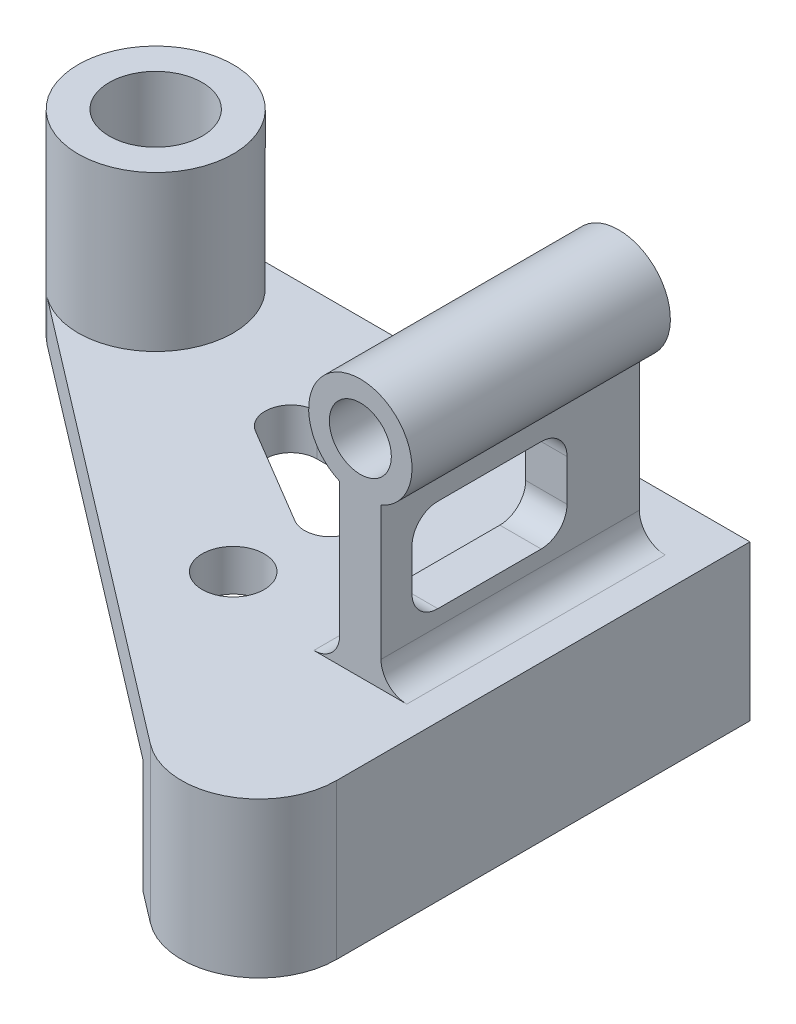
ISO-10303-21;
HEADER;
FILE_DESCRIPTION(('STEP AP214'),'2;1');
FILE_NAME('part.step','',(''),(''),'','','');
FILE_SCHEMA(('AUTOMOTIVE_DESIGN { 1 0 10303 214 1 1 1 1 }'));
ENDSEC;
DATA;
#1=APPLICATION_CONTEXT('core data for automotive mechanical design processes');
#2=APPLICATION_PROTOCOL_DEFINITION('international standard','automotive_design',2000,#1);
#3=PRODUCT_CONTEXT('',#1,'mechanical');
#4=PRODUCT('Part','Part','',(#3));
#5=PRODUCT_RELATED_PRODUCT_CATEGORY('part','',(#4));
#6=PRODUCT_DEFINITION_FORMATION('','',#4);
#7=PRODUCT_DEFINITION_CONTEXT('part definition',#1,'design');
#8=PRODUCT_DEFINITION('design','',#6,#7);
#9=PRODUCT_DEFINITION_SHAPE('','',#8);
#10=(LENGTH_UNIT() NAMED_UNIT(*) SI_UNIT(.MILLI.,.METRE.));
#11=(NAMED_UNIT(*) PLANE_ANGLE_UNIT() SI_UNIT($,.RADIAN.));
#12=(NAMED_UNIT(*) SI_UNIT($,.STERADIAN.) SOLID_ANGLE_UNIT());
#13=UNCERTAINTY_MEASURE_WITH_UNIT(LENGTH_MEASURE(1.E-05),#10,'distance_accuracy_value','');
#14=(GEOMETRIC_REPRESENTATION_CONTEXT(3) GLOBAL_UNCERTAINTY_ASSIGNED_CONTEXT((#13)) GLOBAL_UNIT_ASSIGNED_CONTEXT((#10,
#11,#12)) REPRESENTATION_CONTEXT('',''));
#15=CARTESIAN_POINT('',(0.,0.,0.));
#16=DIRECTION('',(0.,0.,1.));
#17=DIRECTION('',(1.,0.,0.));
#18=AXIS2_PLACEMENT_3D('',#15,#16,#17);
#19=CARTESIAN_POINT('',(0.,50.,10.3951988733973));
#20=DIRECTION('',(0.,0.,-1.));
#21=DIRECTION('',(-1.,0.,0.));
#22=AXIS2_PLACEMENT_3D('',#19,#20,#21);
#23=PLANE('',#22);
#24=CARTESIAN_POINT('',(-15.,40.,10.3951988733973));
#25=DIRECTION('',(0.,0.,-1.));
#26=DIRECTION('',(-1.,0.,0.));
#27=AXIS2_PLACEMENT_3D('',#24,#25,#26);
#28=CIRCLE('',#27,6.);
#29=CARTESIAN_POINT('',(-21.,40.,10.3951988733973));
#30=VERTEX_POINT('',#29);
#31=EDGE_CURVE('E394',#30,#30,#28,.T.);
#32=ORIENTED_EDGE('',*,*,#31,.F.);
#33=EDGE_LOOP('',(#32));
#34=FACE_BOUND('',#33,.T.);
#35=CARTESIAN_POINT('',(-15.,40.,10.3951988733973));
#36=DIRECTION('',(0.,0.,-1.));
#37=DIRECTION('',(-1.,0.,0.));
#38=AXIS2_PLACEMENT_3D('',#35,#36,#37);
#39=CIRCLE('',#38,10.);
#40=CARTESIAN_POINT('',(-19.,30.8348486100883,10.3951988733973));
#41=VERTEX_POINT('',#40);
#42=CARTESIAN_POINT('',(-11.,30.8348486100883,10.3951988733973));
#43=VERTEX_POINT('',#42);
#44=EDGE_CURVE('E415',#41,#43,#39,.T.);
#45=ORIENTED_EDGE('',*,*,#44,.T.);
#46=DIRECTION('',(0.,-1.,0.));
#47=VECTOR('',#46,1.);
#48=CARTESIAN_POINT('',(-11.,50.,10.3951988733973));
#49=LINE('',#48,#47);
#50=CARTESIAN_POINT('',(-11.,5.,10.3951988733973));
#51=VERTEX_POINT('',#50);
#52=EDGE_CURVE('E407',#43,#51,#49,.T.);
#53=ORIENTED_EDGE('',*,*,#52,.T.);
#54=CARTESIAN_POINT('',(-5.99999999999999,5.,10.3951988733973));
#55=DIRECTION('',(0.,0.,-1.));
#56=DIRECTION('',(-1.,0.,0.));
#57=AXIS2_PLACEMENT_3D('',#54,#55,#56);
#58=CIRCLE('',#57,5.);
#59=CARTESIAN_POINT('',(-5.99999999999999,0.,10.3951988733973));
#60=VERTEX_POINT('',#59);
#61=EDGE_CURVE('E554',#51,#60,#58,.F.);
#62=ORIENTED_EDGE('',*,*,#61,.T.);
#63=DIRECTION('',(1.,0.,0.));
#64=VECTOR('',#63,1.);
#65=CARTESIAN_POINT('',(0.,0.,10.3951988733973));
#66=LINE('',#65,#64);
#67=CARTESIAN_POINT('',(-24.,0.,10.3951988733973));
#68=VERTEX_POINT('',#67);
#69=EDGE_CURVE('E417',#68,#60,#66,.T.);
#70=ORIENTED_EDGE('',*,*,#69,.F.);
#71=CARTESIAN_POINT('',(-24.,5.,10.3951988733973));
#72=DIRECTION('',(0.,0.,-1.));
#73=DIRECTION('',(-1.,0.,0.));
#74=AXIS2_PLACEMENT_3D('',#71,#72,#73);
#75=CIRCLE('',#74,5.);
#76=CARTESIAN_POINT('',(-19.,5.,10.3951988733973));
#77=VERTEX_POINT('',#76);
#78=EDGE_CURVE('E12',#68,#77,#75,.F.);
#79=ORIENTED_EDGE('',*,*,#78,.T.);
#80=DIRECTION('',(0.,1.,0.));
#81=VECTOR('',#80,1.);
#82=CARTESIAN_POINT('',(-19.,50.,10.3951988733973));
#83=LINE('',#82,#81);
#84=EDGE_CURVE('E413',#77,#41,#83,.T.);
#85=ORIENTED_EDGE('',*,*,#84,.T.);
#86=EDGE_LOOP('',(#45,#53,#62,#70,#79,#85));
#87=FACE_BOUND('',#86,.T.);
#88=ADVANCED_FACE('F156',(#34,#87),#23,.T.);
#89=CARTESIAN_POINT('',(0.,50.,60.3951988733973));
#90=DIRECTION('',(0.,0.,-1.));
#91=DIRECTION('',(-1.,0.,0.));
#92=AXIS2_PLACEMENT_3D('',#89,#90,#91);
#93=PLANE('',#92);
#94=CARTESIAN_POINT('',(-15.,40.,60.3951988733973));
#95=DIRECTION('',(0.,0.,1.));
#96=DIRECTION('',(1.,0.,0.));
#97=AXIS2_PLACEMENT_3D('',#94,#95,#96);
#98=CIRCLE('',#97,6.);
#99=CARTESIAN_POINT('',(-8.99999999999999,40.,60.3951988733973));
#100=VERTEX_POINT('',#99);
#101=EDGE_CURVE('E391',#100,#100,#98,.T.);
#102=ORIENTED_EDGE('',*,*,#101,.F.);
#103=EDGE_LOOP('',(#102));
#104=FACE_BOUND('',#103,.T.);
#105=DIRECTION('',(1.,0.,0.));
#106=VECTOR('',#105,1.);
#107=CARTESIAN_POINT('',(0.,0.,60.3951988733973));
#108=LINE('',#107,#106);
#109=CARTESIAN_POINT('',(-24.,0.,60.3951988733973));
#110=VERTEX_POINT('',#109);
#111=CARTESIAN_POINT('',(-5.99999999999999,0.,60.3951988733973));
#112=VERTEX_POINT('',#111);
#113=EDGE_CURVE('E419',#110,#112,#108,.T.);
#114=ORIENTED_EDGE('',*,*,#113,.T.);
#115=CARTESIAN_POINT('',(-5.99999999999999,5.,60.3951988733973));
#116=DIRECTION('',(0.,0.,-1.));
#117=DIRECTION('',(-1.,0.,0.));
#118=AXIS2_PLACEMENT_3D('',#115,#116,#117);
#119=CIRCLE('',#118,5.);
#120=CARTESIAN_POINT('',(-11.,5.,60.3951988733973));
#121=VERTEX_POINT('',#120);
#122=EDGE_CURVE('E552',#112,#121,#119,.T.);
#123=ORIENTED_EDGE('',*,*,#122,.T.);
#124=DIRECTION('',(0.,1.,0.));
#125=VECTOR('',#124,1.);
#126=CARTESIAN_POINT('',(-11.,0.,60.3951988733973));
#127=LINE('',#126,#125);
#128=CARTESIAN_POINT('',(-11.,30.8348486100883,60.3951988733973));
#129=VERTEX_POINT('',#128);
#130=EDGE_CURVE('E397',#121,#129,#127,.T.);
#131=ORIENTED_EDGE('',*,*,#130,.T.);
#132=CARTESIAN_POINT('',(-15.,40.,60.3951988733973));
#133=DIRECTION('',(0.,0.,1.));
#134=DIRECTION('',(1.,0.,0.));
#135=AXIS2_PLACEMENT_3D('',#132,#133,#134);
#136=CIRCLE('',#135,10.);
#137=CARTESIAN_POINT('',(-19.,30.8348486100883,60.3951988733973));
#138=VERTEX_POINT('',#137);
#139=EDGE_CURVE('E398',#129,#138,#136,.T.);
#140=ORIENTED_EDGE('',*,*,#139,.T.);
#141=DIRECTION('',(0.,-1.,0.));
#142=VECTOR('',#141,1.);
#143=CARTESIAN_POINT('',(-19.,0.,60.3951988733973));
#144=LINE('',#143,#142);
#145=CARTESIAN_POINT('',(-19.,5.,60.3951988733973));
#146=VERTEX_POINT('',#145);
#147=EDGE_CURVE('E401',#138,#146,#144,.T.);
#148=ORIENTED_EDGE('',*,*,#147,.T.);
#149=CARTESIAN_POINT('',(-24.,5.,60.3951988733973));
#150=DIRECTION('',(0.,0.,-1.));
#151=DIRECTION('',(-1.,0.,0.));
#152=AXIS2_PLACEMENT_3D('',#149,#150,#151);
#153=CIRCLE('',#152,5.);
#154=EDGE_CURVE('E164',#146,#110,#153,.T.);
#155=ORIENTED_EDGE('',*,*,#154,.T.);
#156=EDGE_LOOP('',(#114,#123,#131,#140,#148,#155));
#157=FACE_BOUND('',#156,.T.);
#158=ADVANCED_FACE('F559',(#104,#157),#93,.F.);
#159=CARTESIAN_POINT('',(0.,0.,0.));
#160=DIRECTION('',(0.,1.,0.));
#161=DIRECTION('',(0.,0.,1.));
#162=AXIS2_PLACEMENT_3D('',#159,#160,#161);
#163=PLANE('',#162);
#164=DIRECTION('',(0.,0.,1.));
#165=VECTOR('',#164,1.);
#166=CARTESIAN_POINT('',(-5.99999999999999,0.,60.3951988733973));
#167=LINE('',#166,#165);
#168=EDGE_CURVE('E544',#60,#112,#167,.T.);
#169=ORIENTED_EDGE('',*,*,#168,.T.);
#170=ORIENTED_EDGE('',*,*,#113,.F.);
#171=DIRECTION('',(0.,0.,1.));
#172=VECTOR('',#171,1.);
#173=CARTESIAN_POINT('',(-24.,0.,10.3951988733973));
#174=LINE('',#173,#172);
#175=EDGE_CURVE('E431',#110,#68,#174,.F.);
#176=ORIENTED_EDGE('',*,*,#175,.T.);
#177=ORIENTED_EDGE('',*,*,#69,.T.);
#178=EDGE_LOOP('',(#169,#170,#176,#177));
#179=FACE_BOUND('',#178,.T.);
#180=DIRECTION('',(-1.,0.,0.));
#181=VECTOR('',#180,1.);
#182=CARTESIAN_POINT('',(0.,0.,0.));
#183=LINE('',#182,#181);
#184=CARTESIAN_POINT('',(0.,0.,0.));
#185=VERTEX_POINT('',#184);
#186=CARTESIAN_POINT('',(-100.,0.,0.));
#187=VERTEX_POINT('',#186);
#188=EDGE_CURVE('E496',#185,#187,#183,.T.);
#189=ORIENTED_EDGE('',*,*,#188,.T.);
#190=CARTESIAN_POINT('',(-100.,0.,15.));
#191=DIRECTION('',(0.,1.,0.));
#192=DIRECTION('',(0.,0.,1.));
#193=AXIS2_PLACEMENT_3D('',#190,#191,#192);
#194=CIRCLE('',#193,15.);
#195=CARTESIAN_POINT('',(-109.111751613562,0.,26.9153674946579));
#196=VERTEX_POINT('',#195);
#197=EDGE_CURVE('E428',#196,#187,#194,.T.);
#198=ORIENTED_EDGE('',*,*,#197,.F.);
#199=DIRECTION('',(-0.794357832977196,0.,-0.607450107570797));
#200=VECTOR('',#199,1.);
#201=CARTESIAN_POINT('',(-53.2493061987148,0.,69.6337081060117));
#202=LINE('',#201,#200);
#203=CARTESIAN_POINT('',(-24.1117516135619,0.,91.9153674946579));
#204=VERTEX_POINT('',#203);
#205=EDGE_CURVE('E487',#204,#196,#202,.T.);
#206=ORIENTED_EDGE('',*,*,#205,.F.);
#207=CARTESIAN_POINT('',(-15.,0.,80.));
#208=DIRECTION('',(0.,1.,0.));
#209=DIRECTION('',(0.,0.,1.));
#210=AXIS2_PLACEMENT_3D('',#207,#208,#209);
#211=CIRCLE('',#210,15.);
#212=CARTESIAN_POINT('',(0.,0.,80.));
#213=VERTEX_POINT('',#212);
#214=EDGE_CURVE('E490',#204,#213,#211,.T.);
#215=ORIENTED_EDGE('',*,*,#214,.T.);
#216=DIRECTION('',(0.,0.,1.));
#217=VECTOR('',#216,1.);
#218=CARTESIAN_POINT('',(0.,0.,0.));
#219=LINE('',#218,#217);
#220=EDGE_CURVE('E493',#185,#213,#219,.T.);
#221=ORIENTED_EDGE('',*,*,#220,.F.);
#222=EDGE_LOOP('',(#189,#198,#206,#215,#221));
#223=FACE_BOUND('',#222,.T.);
#224=CARTESIAN_POINT('',(-45.,0.,55.));
#225=DIRECTION('',(0.,1.,0.));
#226=DIRECTION('',(0.,0.,1.));
#227=AXIS2_PLACEMENT_3D('',#224,#225,#226);
#228=CIRCLE('',#227,6.);
#229=CARTESIAN_POINT('',(-45.,0.,61.));
#230=VERTEX_POINT('',#229);
#231=EDGE_CURVE('E468',#230,#230,#228,.T.);
#232=ORIENTED_EDGE('',*,*,#231,.F.);
#233=EDGE_LOOP('',(#232));
#234=FACE_BOUND('',#233,.T.);
#235=CARTESIAN_POINT('',(-45.,0.,10.));
#236=DIRECTION('',(0.,1.,0.));
#237=DIRECTION('',(0.,0.,1.));
#238=AXIS2_PLACEMENT_3D('',#235,#236,#237);
#239=CIRCLE('',#238,6.);
#240=CARTESIAN_POINT('',(-45.,0.,16.));
#241=VERTEX_POINT('',#240);
#242=EDGE_CURVE('E484',#241,#241,#239,.T.);
#243=ORIENTED_EDGE('',*,*,#242,.F.);
#244=EDGE_LOOP('',(#243));
#245=FACE_BOUND('',#244,.T.);
#246=DIRECTION('',(0.,0.,1.));
#247=VECTOR('',#246,1.);
#248=CARTESIAN_POINT('',(-40.,0.,0.));
#249=LINE('',#248,#247);
#250=CARTESIAN_POINT('',(-40.,0.,25.));
#251=VERTEX_POINT('',#250);
#252=CARTESIAN_POINT('',(-40.,0.,36.2050717095953));
#253=VERTEX_POINT('',#252);
#254=EDGE_CURVE('E498',#251,#253,#249,.T.);
#255=ORIENTED_EDGE('',*,*,#254,.T.);
#256=CARTESIAN_POINT('',(-45.,0.,36.2050717095953));
#257=DIRECTION('',(0.,1.,0.));
#258=DIRECTION('',(0.,0.,1.));
#259=AXIS2_PLACEMENT_3D('',#256,#257,#258);
#260=CIRCLE('',#259,5.);
#261=CARTESIAN_POINT('',(-47.5574192988384,0.,40.5015361316438));
#262=VERTEX_POINT('',#261);
#263=EDGE_CURVE('E501',#253,#262,#260,.F.);
#264=ORIENTED_EDGE('',*,*,#263,.T.);
#265=DIRECTION('',(-0.859292884409707,0.,-0.511483859767682));
#266=VECTOR('',#265,1.);
#267=CARTESIAN_POINT('',(-30.242779405609,0.,50.8078694014232));
#268=LINE('',#267,#266);
#269=CARTESIAN_POINT('',(-66.3819397709584,0.,29.2964644220486));
#270=VERTEX_POINT('',#269);
#271=EDGE_CURVE('E504',#262,#270,#268,.T.);
#272=ORIENTED_EDGE('',*,*,#271,.T.);
#273=CARTESIAN_POINT('',(-63.82452047212,0.,25.));
#274=DIRECTION('',(0.,1.,0.));
#275=DIRECTION('',(0.,0.,1.));
#276=AXIS2_PLACEMENT_3D('',#273,#274,#275);
#277=CIRCLE('',#276,5.00000000000001);
#278=CARTESIAN_POINT('',(-63.82452047212,0.,20.));
#279=VERTEX_POINT('',#278);
#280=EDGE_CURVE('E507',#279,#270,#277,.T.);
#281=ORIENTED_EDGE('',*,*,#280,.F.);
#282=DIRECTION('',(1.,0.,0.));
#283=VECTOR('',#282,1.);
#284=CARTESIAN_POINT('',(0.,0.,20.));
#285=LINE('',#284,#283);
#286=CARTESIAN_POINT('',(-45.,0.,20.));
#287=VERTEX_POINT('',#286);
#288=EDGE_CURVE('E510',#279,#287,#285,.T.);
#289=ORIENTED_EDGE('',*,*,#288,.T.);
#290=CARTESIAN_POINT('',(-45.,0.,25.));
#291=DIRECTION('',(0.,1.,0.));
#292=DIRECTION('',(0.,0.,1.));
#293=AXIS2_PLACEMENT_3D('',#290,#291,#292);
#294=CIRCLE('',#293,5.);
#295=EDGE_CURVE('E473',#251,#287,#294,.T.);
#296=ORIENTED_EDGE('',*,*,#295,.F.);
#297=EDGE_LOOP('',(#255,#264,#272,#281,#289,#296));
#298=FACE_BOUND('',#297,.T.);
#299=ADVANCED_FACE('F566',(#179,#223,#234,#245,#298),#163,.T.);
#300=CARTESIAN_POINT('',(-40.,-30.,0.));
#301=DIRECTION('',(-1.,0.,0.));
#302=DIRECTION('',(0.,0.,1.));
#303=AXIS2_PLACEMENT_3D('',#300,#301,#302);
#304=PLANE('',#303);
#305=DIRECTION('',(0.,0.,-1.));
#306=VECTOR('',#305,1.);
#307=CARTESIAN_POINT('',(-40.,-8.,0.));
#308=LINE('',#307,#306);
#309=CARTESIAN_POINT('',(-40.,-8.,36.2050717095953));
#310=VERTEX_POINT('',#309);
#311=CARTESIAN_POINT('',(-40.,-8.,25.));
#312=VERTEX_POINT('',#311);
#313=EDGE_CURVE('E461',#310,#312,#308,.T.);
#314=ORIENTED_EDGE('',*,*,#313,.F.);
#315=DIRECTION('',(0.,1.,0.));
#316=VECTOR('',#315,1.);
#317=CARTESIAN_POINT('',(-40.,-30.,36.2050717095953));
#318=LINE('',#317,#316);
#319=EDGE_CURVE('E525',#310,#253,#318,.T.);
#320=ORIENTED_EDGE('',*,*,#319,.T.);
#321=ORIENTED_EDGE('',*,*,#254,.F.);
#322=DIRECTION('',(0.,1.,0.));
#323=VECTOR('',#322,1.);
#324=CARTESIAN_POINT('',(-40.,-30.,25.));
#325=LINE('',#324,#323);
#326=EDGE_CURVE('E515',#312,#251,#325,.T.);
#327=ORIENTED_EDGE('',*,*,#326,.F.);
#328=EDGE_LOOP('',(#314,#320,#321,#327));
#329=FACE_BOUND('',#328,.T.);
#330=ADVANCED_FACE('F615',(#329),#304,.T.);
#331=CARTESIAN_POINT('',(-45.,-30.,25.));
#332=DIRECTION('',(0.,1.,0.));
#333=DIRECTION('',(0.,0.,1.));
#334=AXIS2_PLACEMENT_3D('',#331,#332,#333);
#335=CYLINDRICAL_SURFACE('',#334,5.);
#336=DIRECTION('',(0.,1.,0.));
#337=VECTOR('',#336,1.);
#338=CARTESIAN_POINT('',(-45.,-30.,20.));
#339=LINE('',#338,#337);
#340=CARTESIAN_POINT('',(-45.,-8.,20.));
#341=VERTEX_POINT('',#340);
#342=EDGE_CURVE('E517',#341,#287,#339,.T.);
#343=ORIENTED_EDGE('',*,*,#342,.F.);
#344=CARTESIAN_POINT('',(-45.,-8.,25.));
#345=DIRECTION('',(0.,1.,0.));
#346=DIRECTION('',(0.,0.,1.));
#347=AXIS2_PLACEMENT_3D('',#344,#345,#346);
#348=CIRCLE('',#347,5.);
#349=EDGE_CURVE('E458',#341,#312,#348,.F.);
#350=ORIENTED_EDGE('',*,*,#349,.T.);
#351=ORIENTED_EDGE('',*,*,#326,.T.);
#352=ORIENTED_EDGE('',*,*,#295,.T.);
#353=EDGE_LOOP('',(#343,#350,#351,#352));
#354=FACE_BOUND('',#353,.T.);
#355=ADVANCED_FACE('F620',(#354),#335,.F.);
#356=CARTESIAN_POINT('',(0.,-30.,20.));
#357=DIRECTION('',(0.,0.,1.));
#358=DIRECTION('',(1.,0.,0.));
#359=AXIS2_PLACEMENT_3D('',#356,#357,#358);
#360=PLANE('',#359);
#361=DIRECTION('',(-1.,0.,0.));
#362=VECTOR('',#361,1.);
#363=CARTESIAN_POINT('',(0.,-8.,20.));
#364=LINE('',#363,#362);
#365=CARTESIAN_POINT('',(-63.82452047212,-8.,20.));
#366=VERTEX_POINT('',#365);
#367=EDGE_CURVE('E456',#341,#366,#364,.T.);
#368=ORIENTED_EDGE('',*,*,#367,.F.);
#369=ORIENTED_EDGE('',*,*,#342,.T.);
#370=ORIENTED_EDGE('',*,*,#288,.F.);
#371=DIRECTION('',(0.,1.,0.));
#372=VECTOR('',#371,1.);
#373=CARTESIAN_POINT('',(-63.82452047212,-30.,20.));
#374=LINE('',#373,#372);
#375=EDGE_CURVE('E519',#366,#279,#374,.T.);
#376=ORIENTED_EDGE('',*,*,#375,.F.);
#377=EDGE_LOOP('',(#368,#369,#370,#376));
#378=FACE_BOUND('',#377,.T.);
#379=ADVANCED_FACE('F623',(#378),#360,.T.);
#380=CARTESIAN_POINT('',(-63.82452047212,-30.,25.));
#381=DIRECTION('',(0.,1.,0.));
#382=DIRECTION('',(0.,0.,1.));
#383=AXIS2_PLACEMENT_3D('',#380,#381,#382);
#384=CYLINDRICAL_SURFACE('',#383,5.00000000000001);
#385=DIRECTION('',(0.,1.,0.));
#386=VECTOR('',#385,1.);
#387=CARTESIAN_POINT('',(-66.3819397709584,-30.,29.2964644220486));
#388=LINE('',#387,#386);
#389=CARTESIAN_POINT('',(-66.3819397709584,-8.,29.2964644220486));
#390=VERTEX_POINT('',#389);
#391=EDGE_CURVE('E521',#390,#270,#388,.T.);
#392=ORIENTED_EDGE('',*,*,#391,.F.);
#393=CARTESIAN_POINT('',(-63.82452047212,-8.,25.));
#394=DIRECTION('',(0.,1.,0.));
#395=DIRECTION('',(0.,0.,1.));
#396=AXIS2_PLACEMENT_3D('',#393,#394,#395);
#397=CIRCLE('',#396,5.00000000000001);
#398=EDGE_CURVE('E453',#390,#366,#397,.F.);
#399=ORIENTED_EDGE('',*,*,#398,.T.);
#400=ORIENTED_EDGE('',*,*,#375,.T.);
#401=ORIENTED_EDGE('',*,*,#280,.T.);
#402=EDGE_LOOP('',(#392,#399,#400,#401));
#403=FACE_BOUND('',#402,.T.);
#404=ADVANCED_FACE('F627',(#403),#384,.F.);
#405=CARTESIAN_POINT('',(-30.242779405609,-30.,50.8078694014232));
#406=DIRECTION('',(0.511483859767682,0.,-0.859292884409707));
#407=DIRECTION('',(-0.859292884409707,0.,-0.511483859767682));
#408=AXIS2_PLACEMENT_3D('',#405,#406,#407);
#409=PLANE('',#408);
#410=DIRECTION('',(0.859292884409707,0.,0.511483859767682));
#411=VECTOR('',#410,1.);
#412=CARTESIAN_POINT('',(-30.242779405609,-8.,50.8078694014232));
#413=LINE('',#412,#411);
#414=CARTESIAN_POINT('',(-47.5574192988384,-8.,40.5015361316438));
#415=VERTEX_POINT('',#414);
#416=EDGE_CURVE('E451',#390,#415,#413,.T.);
#417=ORIENTED_EDGE('',*,*,#416,.F.);
#418=ORIENTED_EDGE('',*,*,#391,.T.);
#419=ORIENTED_EDGE('',*,*,#271,.F.);
#420=DIRECTION('',(0.,1.,0.));
#421=VECTOR('',#420,1.);
#422=CARTESIAN_POINT('',(-47.5574192988384,-30.,40.5015361316438));
#423=LINE('',#422,#421);
#424=EDGE_CURVE('E523',#415,#262,#423,.T.);
#425=ORIENTED_EDGE('',*,*,#424,.F.);
#426=EDGE_LOOP('',(#417,#418,#419,#425));
#427=FACE_BOUND('',#426,.T.);
#428=ADVANCED_FACE('F631',(#427),#409,.T.);
#429=CARTESIAN_POINT('',(-53.2493061987148,-30.,69.6337081060117));
#430=DIRECTION('',(0.607450107570797,0.,-0.794357832977196));
#431=DIRECTION('',(-0.794357832977196,0.,-0.607450107570797));
#432=AXIS2_PLACEMENT_3D('',#429,#430,#431);
#433=PLANE('',#432);
#434=DIRECTION('',(0.794357832977196,0.,0.607450107570797));
#435=VECTOR('',#434,1.);
#436=CARTESIAN_POINT('',(-53.2493061987148,-8.,69.6337081060117));
#437=LINE('',#436,#435);
#438=CARTESIAN_POINT('',(-109.111751613562,-8.,26.9153674946579));
#439=VERTEX_POINT('',#438);
#440=CARTESIAN_POINT('',(-30.,-8.,87.4125893167935));
#441=VERTEX_POINT('',#440);
#442=EDGE_CURVE('E465',#439,#441,#437,.T.);
#443=ORIENTED_EDGE('',*,*,#442,.T.);
#444=DIRECTION('',(0.,-1.,0.));
#445=VECTOR('',#444,1.);
#446=CARTESIAN_POINT('',(-30.,-30.,87.4125893167935));
#447=LINE('',#446,#445);
#448=CARTESIAN_POINT('',(-30.,-30.,87.4125893167935));
#449=VERTEX_POINT('',#448);
#450=EDGE_CURVE('E439',#441,#449,#447,.T.);
#451=ORIENTED_EDGE('',*,*,#450,.T.);
#452=DIRECTION('',(-0.794357832977196,0.,-0.607450107570797));
#453=VECTOR('',#452,1.);
#454=CARTESIAN_POINT('',(-53.2493061987148,-30.,69.6337081060117));
#455=LINE('',#454,#453);
#456=CARTESIAN_POINT('',(-24.1117516135619,-30.,91.9153674946579));
#457=VERTEX_POINT('',#456);
#458=EDGE_CURVE('E469',#457,#449,#455,.T.);
#459=ORIENTED_EDGE('',*,*,#458,.F.);
#460=DIRECTION('',(0.,1.,0.));
#461=VECTOR('',#460,1.);
#462=CARTESIAN_POINT('',(-24.1117516135619,-30.,91.9153674946579));
#463=LINE('',#462,#461);
#464=EDGE_CURVE('E481',#457,#204,#463,.T.);
#465=ORIENTED_EDGE('',*,*,#464,.T.);
#466=ORIENTED_EDGE('',*,*,#205,.T.);
#467=DIRECTION('',(0.,1.,0.));
#468=VECTOR('',#467,1.);
#469=CARTESIAN_POINT('',(-109.111751613562,-30.,26.9153674946579));
#470=LINE('',#469,#468);
#471=EDGE_CURVE('E527',#439,#196,#470,.T.);
#472=ORIENTED_EDGE('',*,*,#471,.F.);
#473=EDGE_LOOP('',(#443,#451,#459,#465,#466,#472));
#474=FACE_BOUND('',#473,.T.);
#475=ADVANCED_FACE('F635',(#474),#433,.F.);
#476=CARTESIAN_POINT('',(-100.,-30.,15.));
#477=DIRECTION('',(0.,1.,0.));
#478=DIRECTION('',(0.,0.,1.));
#479=AXIS2_PLACEMENT_3D('',#476,#477,#478);
#480=CYLINDRICAL_SURFACE('',#479,15.);
#481=CARTESIAN_POINT('',(-100.,-8.,15.));
#482=DIRECTION('',(0.,1.,0.));
#483=DIRECTION('',(0.,0.,1.));
#484=AXIS2_PLACEMENT_3D('',#481,#482,#483);
#485=CIRCLE('',#484,15.);
#486=CARTESIAN_POINT('',(-100.,-8.,0.));
#487=VERTEX_POINT('',#486);
#488=EDGE_CURVE('E463',#439,#487,#485,.F.);
#489=ORIENTED_EDGE('',*,*,#488,.F.);
#490=ORIENTED_EDGE('',*,*,#471,.T.);
#491=ORIENTED_EDGE('',*,*,#197,.T.);
#492=DIRECTION('',(0.,1.,0.));
#493=VECTOR('',#492,1.);
#494=CARTESIAN_POINT('',(-100.,-30.,0.));
#495=LINE('',#494,#493);
#496=EDGE_CURVE('E530',#487,#187,#495,.T.);
#497=ORIENTED_EDGE('',*,*,#496,.F.);
#498=EDGE_LOOP('',(#489,#490,#491,#497));
#499=FACE_BOUND('',#498,.T.);
#500=CARTESIAN_POINT('',(-100.,30.,15.));
#501=DIRECTION('',(0.,1.,0.));
#502=DIRECTION('',(0.,0.,1.));
#503=AXIS2_PLACEMENT_3D('',#500,#501,#502);
#504=CIRCLE('',#503,15.);
#505=CARTESIAN_POINT('',(-100.,30.,30.));
#506=VERTEX_POINT('',#505);
#507=EDGE_CURVE('E424',#506,#506,#504,.T.);
#508=ORIENTED_EDGE('',*,*,#507,.F.);
#509=EDGE_LOOP('',(#508));
#510=FACE_BOUND('',#509,.T.);
#511=ADVANCED_FACE('F646',(#499,#510),#480,.T.);
#512=CARTESIAN_POINT('',(0.,-30.,0.));
#513=DIRECTION('',(0.,0.,-1.));
#514=DIRECTION('',(-1.,0.,0.));
#515=AXIS2_PLACEMENT_3D('',#512,#513,#514);
#516=PLANE('',#515);
#517=DIRECTION('',(0.,-1.,0.));
#518=VECTOR('',#517,1.);
#519=CARTESIAN_POINT('',(-30.,-8.,0.));
#520=LINE('',#519,#518);
#521=CARTESIAN_POINT('',(-30.,-8.,0.));
#522=VERTEX_POINT('',#521);
#523=CARTESIAN_POINT('',(-30.,-30.,0.));
#524=VERTEX_POINT('',#523);
#525=EDGE_CURVE('E427',#522,#524,#520,.T.);
#526=ORIENTED_EDGE('',*,*,#525,.F.);
#527=DIRECTION('',(1.,0.,0.));
#528=VECTOR('',#527,1.);
#529=CARTESIAN_POINT('',(-30.,-8.,0.));
#530=LINE('',#529,#528);
#531=EDGE_CURVE('E434',#487,#522,#530,.T.);
#532=ORIENTED_EDGE('',*,*,#531,.F.);
#533=ORIENTED_EDGE('',*,*,#496,.T.);
#534=ORIENTED_EDGE('',*,*,#188,.F.);
#535=DIRECTION('',(0.,1.,0.));
#536=VECTOR('',#535,1.);
#537=CARTESIAN_POINT('',(0.,-30.,0.));
#538=LINE('',#537,#536);
#539=CARTESIAN_POINT('',(0.,-30.,0.));
#540=VERTEX_POINT('',#539);
#541=EDGE_CURVE('E533',#540,#185,#538,.T.);
#542=ORIENTED_EDGE('',*,*,#541,.F.);
#543=DIRECTION('',(-1.,0.,0.));
#544=VECTOR('',#543,1.);
#545=CARTESIAN_POINT('',(0.,-30.,0.));
#546=LINE('',#545,#544);
#547=EDGE_CURVE('E478',#540,#524,#546,.T.);
#548=ORIENTED_EDGE('',*,*,#547,.T.);
#549=EDGE_LOOP('',(#526,#532,#533,#534,#542,#548));
#550=FACE_BOUND('',#549,.T.);
#551=ADVANCED_FACE('F649',(#550),#516,.T.);
#552=CARTESIAN_POINT('',(0.,-30.,0.));
#553=DIRECTION('',(-1.,0.,0.));
#554=DIRECTION('',(0.,0.,1.));
#555=AXIS2_PLACEMENT_3D('',#552,#553,#554);
#556=PLANE('',#555);
#557=ORIENTED_EDGE('',*,*,#220,.T.);
#558=DIRECTION('',(0.,1.,0.));
#559=VECTOR('',#558,1.);
#560=CARTESIAN_POINT('',(0.,-30.,80.));
#561=LINE('',#560,#559);
#562=CARTESIAN_POINT('',(0.,-30.,80.));
#563=VERTEX_POINT('',#562);
#564=EDGE_CURVE('E535',#563,#213,#561,.T.);
#565=ORIENTED_EDGE('',*,*,#564,.F.);
#566=DIRECTION('',(0.,0.,1.));
#567=VECTOR('',#566,1.);
#568=CARTESIAN_POINT('',(0.,-30.,0.));
#569=LINE('',#568,#567);
#570=EDGE_CURVE('E476',#540,#563,#569,.T.);
#571=ORIENTED_EDGE('',*,*,#570,.F.);
#572=ORIENTED_EDGE('',*,*,#541,.T.);
#573=EDGE_LOOP('',(#557,#565,#571,#572));
#574=FACE_BOUND('',#573,.T.);
#575=ADVANCED_FACE('F641',(#574),#556,.F.);
#576=CARTESIAN_POINT('',(-45.,-30.,36.2050717095953));
#577=DIRECTION('',(0.,1.,0.));
#578=DIRECTION('',(0.,0.,1.));
#579=AXIS2_PLACEMENT_3D('',#576,#577,#578);
#580=CYLINDRICAL_SURFACE('',#579,5.);
#581=CARTESIAN_POINT('',(-45.,-8.,36.2050717095953));
#582=DIRECTION('',(0.,1.,0.));
#583=DIRECTION('',(0.,0.,1.));
#584=AXIS2_PLACEMENT_3D('',#581,#582,#583);
#585=CIRCLE('',#584,5.);
#586=EDGE_CURVE('E449',#415,#310,#585,.T.);
#587=ORIENTED_EDGE('',*,*,#586,.F.);
#588=ORIENTED_EDGE('',*,*,#424,.T.);
#589=ORIENTED_EDGE('',*,*,#263,.F.);
#590=ORIENTED_EDGE('',*,*,#319,.F.);
#591=EDGE_LOOP('',(#587,#588,#589,#590));
#592=FACE_BOUND('',#591,.T.);
#593=ADVANCED_FACE('F637',(#592),#580,.F.);
#594=CARTESIAN_POINT('',(-15.,-30.,80.));
#595=DIRECTION('',(0.,1.,0.));
#596=DIRECTION('',(0.,0.,1.));
#597=AXIS2_PLACEMENT_3D('',#594,#595,#596);
#598=CYLINDRICAL_SURFACE('',#597,15.);
#599=ORIENTED_EDGE('',*,*,#214,.F.);
#600=ORIENTED_EDGE('',*,*,#464,.F.);
#601=CARTESIAN_POINT('',(-15.,-30.,80.));
#602=DIRECTION('',(0.,1.,0.));
#603=DIRECTION('',(0.,0.,1.));
#604=AXIS2_PLACEMENT_3D('',#601,#602,#603);
#605=CIRCLE('',#604,15.);
#606=EDGE_CURVE('E472',#457,#563,#605,.T.);
#607=ORIENTED_EDGE('',*,*,#606,.T.);
#608=ORIENTED_EDGE('',*,*,#564,.T.);
#609=EDGE_LOOP('',(#599,#600,#607,#608));
#610=FACE_BOUND('',#609,.T.);
#611=ADVANCED_FACE('F640',(#610),#598,.T.);
#612=CARTESIAN_POINT('',(-45.,-30.,10.));
#613=DIRECTION('',(0.,1.,0.));
#614=DIRECTION('',(0.,0.,1.));
#615=AXIS2_PLACEMENT_3D('',#612,#613,#614);
#616=CYLINDRICAL_SURFACE('',#615,6.);
#617=CARTESIAN_POINT('',(-45.,-8.,10.));
#618=DIRECTION('',(0.,1.,0.));
#619=DIRECTION('',(0.,0.,1.));
#620=AXIS2_PLACEMENT_3D('',#617,#618,#619);
#621=CIRCLE('',#620,6.);
#622=CARTESIAN_POINT('',(-45.,-8.,16.));
#623=VERTEX_POINT('',#622);
#624=EDGE_CURVE('E446',#623,#623,#621,.F.);
#625=ORIENTED_EDGE('',*,*,#624,.T.);
#626=EDGE_LOOP('',(#625));
#627=FACE_BOUND('',#626,.T.);
#628=ORIENTED_EDGE('',*,*,#242,.T.);
#629=EDGE_LOOP('',(#628));
#630=FACE_BOUND('',#629,.T.);
#631=ADVANCED_FACE('F659',(#627,#630),#616,.F.);
#632=CARTESIAN_POINT('',(-45.,-30.,55.));
#633=DIRECTION('',(0.,1.,0.));
#634=DIRECTION('',(0.,0.,1.));
#635=AXIS2_PLACEMENT_3D('',#632,#633,#634);
#636=CYLINDRICAL_SURFACE('',#635,6.);
#637=CARTESIAN_POINT('',(-45.,-8.,55.));
#638=DIRECTION('',(0.,1.,0.));
#639=DIRECTION('',(0.,0.,1.));
#640=AXIS2_PLACEMENT_3D('',#637,#638,#639);
#641=CIRCLE('',#640,6.);
#642=CARTESIAN_POINT('',(-45.,-8.,61.));
#643=VERTEX_POINT('',#642);
#644=EDGE_CURVE('E443',#643,#643,#641,.F.);
#645=ORIENTED_EDGE('',*,*,#644,.T.);
#646=EDGE_LOOP('',(#645));
#647=FACE_BOUND('',#646,.T.);
#648=ORIENTED_EDGE('',*,*,#231,.T.);
#649=EDGE_LOOP('',(#648));
#650=FACE_BOUND('',#649,.T.);
#651=ADVANCED_FACE('F618',(#647,#650),#636,.F.);
#652=CARTESIAN_POINT('',(-100.,-30.,15.));
#653=DIRECTION('',(0.,1.,0.));
#654=DIRECTION('',(0.,0.,1.));
#655=AXIS2_PLACEMENT_3D('',#652,#653,#654);
#656=CYLINDRICAL_SURFACE('',#655,9.);
#657=CARTESIAN_POINT('',(-100.,-8.,15.));
#658=DIRECTION('',(0.,1.,0.));
#659=DIRECTION('',(0.,0.,1.));
#660=AXIS2_PLACEMENT_3D('',#657,#658,#659);
#661=CIRCLE('',#660,9.);
#662=CARTESIAN_POINT('',(-100.,-8.,24.));
#663=VERTEX_POINT('',#662);
#664=EDGE_CURVE('E442',#663,#663,#661,.F.);
#665=ORIENTED_EDGE('',*,*,#664,.T.);
#666=EDGE_LOOP('',(#665));
#667=FACE_BOUND('',#666,.T.);
#668=CARTESIAN_POINT('',(-100.,30.,15.));
#669=DIRECTION('',(0.,1.,0.));
#670=DIRECTION('',(0.,0.,1.));
#671=AXIS2_PLACEMENT_3D('',#668,#669,#670);
#672=CIRCLE('',#671,9.);
#673=CARTESIAN_POINT('',(-100.,30.,24.));
#674=VERTEX_POINT('',#673);
#675=EDGE_CURVE('E421',#674,#674,#672,.T.);
#676=ORIENTED_EDGE('',*,*,#675,.T.);
#677=EDGE_LOOP('',(#676));
#678=FACE_BOUND('',#677,.T.);
#679=ADVANCED_FACE('F611',(#667,#678),#656,.F.);
#680=CARTESIAN_POINT('',(0.,-30.,0.));
#681=DIRECTION('',(0.,1.,0.));
#682=DIRECTION('',(0.,0.,1.));
#683=AXIS2_PLACEMENT_3D('',#680,#681,#682);
#684=PLANE('',#683);
#685=ORIENTED_EDGE('',*,*,#458,.T.);
#686=DIRECTION('',(0.,0.,-1.));
#687=VECTOR('',#686,1.);
#688=CARTESIAN_POINT('',(-30.,-30.,0.));
#689=LINE('',#688,#687);
#690=EDGE_CURVE('E432',#449,#524,#689,.T.);
#691=ORIENTED_EDGE('',*,*,#690,.T.);
#692=ORIENTED_EDGE('',*,*,#547,.F.);
#693=ORIENTED_EDGE('',*,*,#570,.T.);
#694=ORIENTED_EDGE('',*,*,#606,.F.);
#695=EDGE_LOOP('',(#685,#691,#692,#693,#694));
#696=FACE_BOUND('',#695,.T.);
#697=ADVANCED_FACE('F604',(#696),#684,.F.);
#698=CARTESIAN_POINT('',(-30.,-8.,95.));
#699=DIRECTION('',(0.,1.,0.));
#700=DIRECTION('',(0.,0.,1.));
#701=AXIS2_PLACEMENT_3D('',#698,#699,#700);
#702=PLANE('',#701);
#703=ORIENTED_EDGE('',*,*,#313,.T.);
#704=ORIENTED_EDGE('',*,*,#349,.F.);
#705=ORIENTED_EDGE('',*,*,#367,.T.);
#706=ORIENTED_EDGE('',*,*,#398,.F.);
#707=ORIENTED_EDGE('',*,*,#416,.T.);
#708=ORIENTED_EDGE('',*,*,#586,.T.);
#709=EDGE_LOOP('',(#703,#704,#705,#706,#707,#708));
#710=FACE_BOUND('',#709,.T.);
#711=ORIENTED_EDGE('',*,*,#644,.F.);
#712=EDGE_LOOP('',(#711));
#713=FACE_BOUND('',#712,.T.);
#714=ORIENTED_EDGE('',*,*,#664,.F.);
#715=EDGE_LOOP('',(#714));
#716=FACE_BOUND('',#715,.T.);
#717=ORIENTED_EDGE('',*,*,#624,.F.);
#718=EDGE_LOOP('',(#717));
#719=FACE_BOUND('',#718,.T.);
#720=ORIENTED_EDGE('',*,*,#488,.T.);
#721=ORIENTED_EDGE('',*,*,#531,.T.);
#722=DIRECTION('',(0.,0.,-1.));
#723=VECTOR('',#722,1.);
#724=CARTESIAN_POINT('',(-30.,-8.,95.));
#725=LINE('',#724,#723);
#726=EDGE_CURVE('E437',#441,#522,#725,.T.);
#727=ORIENTED_EDGE('',*,*,#726,.F.);
#728=ORIENTED_EDGE('',*,*,#442,.F.);
#729=EDGE_LOOP('',(#720,#721,#727,#728));
#730=FACE_BOUND('',#729,.T.);
#731=ADVANCED_FACE('F601',(#710,#713,#716,#719,#730),#702,.F.);
#732=CARTESIAN_POINT('',(-30.,-8.,95.));
#733=DIRECTION('',(1.,0.,0.));
#734=DIRECTION('',(0.,1.,0.));
#735=AXIS2_PLACEMENT_3D('',#732,#733,#734);
#736=PLANE('',#735);
#737=ORIENTED_EDGE('',*,*,#726,.T.);
#738=ORIENTED_EDGE('',*,*,#525,.T.);
#739=ORIENTED_EDGE('',*,*,#690,.F.);
#740=ORIENTED_EDGE('',*,*,#450,.F.);
#741=EDGE_LOOP('',(#737,#738,#739,#740));
#742=FACE_BOUND('',#741,.T.);
#743=ADVANCED_FACE('F599',(#742),#736,.F.);
#744=CARTESIAN_POINT('',(0.,30.,0.));
#745=DIRECTION('',(0.,1.,0.));
#746=DIRECTION('',(0.,0.,1.));
#747=AXIS2_PLACEMENT_3D('',#744,#745,#746);
#748=PLANE('',#747);
#749=ORIENTED_EDGE('',*,*,#675,.F.);
#750=EDGE_LOOP('',(#749));
#751=FACE_BOUND('',#750,.T.);
#752=ORIENTED_EDGE('',*,*,#507,.T.);
#753=EDGE_LOOP('',(#752));
#754=FACE_BOUND('',#753,.T.);
#755=ADVANCED_FACE('F596',(#751,#754),#748,.T.);
#756=CARTESIAN_POINT('',(-11.,0.,0.));
#757=DIRECTION('',(1.,0.,0.));
#758=DIRECTION('',(0.,0.,-1.));
#759=AXIS2_PLACEMENT_3D('',#756,#757,#758);
#760=PLANE('',#759);
#761=DIRECTION('',(0.,0.,1.));
#762=VECTOR('',#761,1.);
#763=CARTESIAN_POINT('',(-11.,26.,49.3951988733973));
#764=LINE('',#763,#762);
#765=CARTESIAN_POINT('',(-11.,26.,29.3951988733973));
#766=VERTEX_POINT('',#765);
#767=CARTESIAN_POINT('',(-11.,26.,49.3951988733973));
#768=VERTEX_POINT('',#767);
#769=EDGE_CURVE('E351',#766,#768,#764,.T.);
#770=ORIENTED_EDGE('',*,*,#769,.F.);
#771=CARTESIAN_POINT('',(-11.,21.,29.3951988733973));
#772=DIRECTION('',(1.,0.,0.));
#773=DIRECTION('',(0.,0.,1.));
#774=AXIS2_PLACEMENT_3D('',#771,#772,#773);
#775=CIRCLE('',#774,5.);
#776=CARTESIAN_POINT('',(-11.,21.,24.3951988733973));
#777=VERTEX_POINT('',#776);
#778=EDGE_CURVE('E363',#777,#766,#775,.T.);
#779=ORIENTED_EDGE('',*,*,#778,.F.);
#780=DIRECTION('',(0.,1.,0.));
#781=VECTOR('',#780,1.);
#782=CARTESIAN_POINT('',(-11.,21.,24.3951988733973));
#783=LINE('',#782,#781);
#784=CARTESIAN_POINT('',(-11.,13.,24.3951988733973));
#785=VERTEX_POINT('',#784);
#786=EDGE_CURVE('E171',#785,#777,#783,.T.);
#787=ORIENTED_EDGE('',*,*,#786,.F.);
#788=CARTESIAN_POINT('',(-11.,13.,29.3951988733973));
#789=DIRECTION('',(1.,0.,0.));
#790=DIRECTION('',(0.,0.,-1.));
#791=AXIS2_PLACEMENT_3D('',#788,#789,#790);
#792=CIRCLE('',#791,5.);
#793=CARTESIAN_POINT('',(-11.,8.,29.3951988733973));
#794=VERTEX_POINT('',#793);
#795=EDGE_CURVE('E359',#794,#785,#792,.T.);
#796=ORIENTED_EDGE('',*,*,#795,.F.);
#797=DIRECTION('',(0.,0.,-1.));
#798=VECTOR('',#797,1.);
#799=CARTESIAN_POINT('',(-11.,8.,49.3951988733973));
#800=LINE('',#799,#798);
#801=CARTESIAN_POINT('',(-11.,8.,49.3951988733973));
#802=VERTEX_POINT('',#801);
#803=EDGE_CURVE('E701',#802,#794,#800,.T.);
#804=ORIENTED_EDGE('',*,*,#803,.F.);
#805=CARTESIAN_POINT('',(-11.,13.,49.3951988733973));
#806=DIRECTION('',(1.,0.,0.));
#807=DIRECTION('',(0.,0.,-1.));
#808=AXIS2_PLACEMENT_3D('',#805,#806,#807);
#809=CIRCLE('',#808,5.);
#810=CARTESIAN_POINT('',(-11.,13.,54.3951988733973));
#811=VERTEX_POINT('',#810);
#812=EDGE_CURVE('E698',#811,#802,#809,.T.);
#813=ORIENTED_EDGE('',*,*,#812,.F.);
#814=DIRECTION('',(0.,-1.,0.));
#815=VECTOR('',#814,1.);
#816=CARTESIAN_POINT('',(-11.,21.,54.3951988733973));
#817=LINE('',#816,#815);
#818=CARTESIAN_POINT('',(-11.,21.,54.3951988733973));
#819=VERTEX_POINT('',#818);
#820=EDGE_CURVE('E693',#819,#811,#817,.T.);
#821=ORIENTED_EDGE('',*,*,#820,.F.);
#822=CARTESIAN_POINT('',(-11.,21.,49.3951988733973));
#823=DIRECTION('',(1.,0.,0.));
#824=DIRECTION('',(0.,0.,-1.));
#825=AXIS2_PLACEMENT_3D('',#822,#823,#824);
#826=CIRCLE('',#825,5.);
#827=EDGE_CURVE('E692',#768,#819,#826,.T.);
#828=ORIENTED_EDGE('',*,*,#827,.F.);
#829=EDGE_LOOP('',(#770,#779,#787,#796,#804,#813,#821,#828));
#830=FACE_BOUND('',#829,.T.);
#831=ORIENTED_EDGE('',*,*,#130,.F.);
#832=DIRECTION('',(0.,0.,1.));
#833=VECTOR('',#832,1.);
#834=CARTESIAN_POINT('',(-11.,5.,10.3951988733973));
#835=LINE('',#834,#833);
#836=EDGE_CURVE('E547',#121,#51,#835,.F.);
#837=ORIENTED_EDGE('',*,*,#836,.T.);
#838=ORIENTED_EDGE('',*,*,#52,.F.);
#839=DIRECTION('',(0.,0.,1.));
#840=VECTOR('',#839,1.);
#841=CARTESIAN_POINT('',(-11.,30.8348486100883,0.));
#842=LINE('',#841,#840);
#843=EDGE_CURVE('E402',#43,#129,#842,.T.);
#844=ORIENTED_EDGE('',*,*,#843,.T.);
#845=EDGE_LOOP('',(#831,#837,#838,#844));
#846=FACE_BOUND('',#845,.T.);
#847=ADVANCED_FACE('F576',(#830,#846),#760,.T.);
#848=CARTESIAN_POINT('',(-15.,40.,0.));
#849=DIRECTION('',(0.,0.,1.));
#850=DIRECTION('',(1.,0.,0.));
#851=AXIS2_PLACEMENT_3D('',#848,#849,#850);
#852=CYLINDRICAL_SURFACE('',#851,10.);
#853=DIRECTION('',(0.,0.,1.));
#854=VECTOR('',#853,1.);
#855=CARTESIAN_POINT('',(-19.,30.8348486100883,0.));
#856=LINE('',#855,#854);
#857=EDGE_CURVE('E405',#41,#138,#856,.T.);
#858=ORIENTED_EDGE('',*,*,#857,.T.);
#859=ORIENTED_EDGE('',*,*,#139,.F.);
#860=ORIENTED_EDGE('',*,*,#843,.F.);
#861=ORIENTED_EDGE('',*,*,#44,.F.);
#862=EDGE_LOOP('',(#858,#859,#860,#861));
#863=FACE_BOUND('',#862,.T.);
#864=ADVANCED_FACE('F581',(#863),#852,.T.);
#865=CARTESIAN_POINT('',(-19.,0.,0.));
#866=DIRECTION('',(-1.,0.,0.));
#867=DIRECTION('',(0.,0.,1.));
#868=AXIS2_PLACEMENT_3D('',#865,#866,#867);
#869=PLANE('',#868);
#870=DIRECTION('',(0.,0.,1.));
#871=VECTOR('',#870,1.);
#872=CARTESIAN_POINT('',(-19.,26.,49.3951988733973));
#873=LINE('',#872,#871);
#874=CARTESIAN_POINT('',(-19.,26.,29.3951988733973));
#875=VERTEX_POINT('',#874);
#876=CARTESIAN_POINT('',(-19.,26.,49.3951988733973));
#877=VERTEX_POINT('',#876);
#878=EDGE_CURVE('E348',#875,#877,#873,.T.);
#879=ORIENTED_EDGE('',*,*,#878,.T.);
#880=CARTESIAN_POINT('',(-19.,21.,49.3951988733973));
#881=DIRECTION('',(-1.,0.,0.));
#882=DIRECTION('',(0.,0.,1.));
#883=AXIS2_PLACEMENT_3D('',#880,#881,#882);
#884=CIRCLE('',#883,5.);
#885=CARTESIAN_POINT('',(-19.,21.,54.3951988733973));
#886=VERTEX_POINT('',#885);
#887=EDGE_CURVE('E335',#877,#886,#884,.F.);
#888=ORIENTED_EDGE('',*,*,#887,.T.);
#889=DIRECTION('',(0.,-1.,0.));
#890=VECTOR('',#889,1.);
#891=CARTESIAN_POINT('',(-19.,21.,54.3951988733973));
#892=LINE('',#891,#890);
#893=CARTESIAN_POINT('',(-19.,13.,54.3951988733973));
#894=VERTEX_POINT('',#893);
#895=EDGE_CURVE('E382',#886,#894,#892,.T.);
#896=ORIENTED_EDGE('',*,*,#895,.T.);
#897=CARTESIAN_POINT('',(-19.,13.,49.3951988733973));
#898=DIRECTION('',(-1.,0.,0.));
#899=DIRECTION('',(0.,0.,1.));
#900=AXIS2_PLACEMENT_3D('',#897,#898,#899);
#901=CIRCLE('',#900,5.);
#902=CARTESIAN_POINT('',(-19.,8.,49.3951988733973));
#903=VERTEX_POINT('',#902);
#904=EDGE_CURVE('E378',#894,#903,#901,.F.);
#905=ORIENTED_EDGE('',*,*,#904,.T.);
#906=DIRECTION('',(0.,0.,-1.));
#907=VECTOR('',#906,1.);
#908=CARTESIAN_POINT('',(-19.,8.,49.3951988733973));
#909=LINE('',#908,#907);
#910=CARTESIAN_POINT('',(-19.,8.,29.3951988733973));
#911=VERTEX_POINT('',#910);
#912=EDGE_CURVE('E374',#903,#911,#909,.T.);
#913=ORIENTED_EDGE('',*,*,#912,.T.);
#914=CARTESIAN_POINT('',(-19.,13.,29.3951988733973));
#915=DIRECTION('',(-1.,0.,0.));
#916=DIRECTION('',(0.,0.,1.));
#917=AXIS2_PLACEMENT_3D('',#914,#915,#916);
#918=CIRCLE('',#917,5.);
#919=CARTESIAN_POINT('',(-19.,13.,24.3951988733973));
#920=VERTEX_POINT('',#919);
#921=EDGE_CURVE('E370',#911,#920,#918,.F.);
#922=ORIENTED_EDGE('',*,*,#921,.T.);
#923=DIRECTION('',(0.,1.,0.));
#924=VECTOR('',#923,1.);
#925=CARTESIAN_POINT('',(-19.,21.,24.3951988733973));
#926=LINE('',#925,#924);
#927=CARTESIAN_POINT('',(-19.,21.,24.3951988733973));
#928=VERTEX_POINT('',#927);
#929=EDGE_CURVE('E367',#920,#928,#926,.T.);
#930=ORIENTED_EDGE('',*,*,#929,.T.);
#931=CARTESIAN_POINT('',(-19.,21.,29.3951988733973));
#932=DIRECTION('',(-1.,0.,0.));
#933=DIRECTION('',(0.,0.,1.));
#934=AXIS2_PLACEMENT_3D('',#931,#932,#933);
#935=CIRCLE('',#934,5.);
#936=EDGE_CURVE('E357',#928,#875,#935,.F.);
#937=ORIENTED_EDGE('',*,*,#936,.T.);
#938=EDGE_LOOP('',(#879,#888,#896,#905,#913,#922,#930,#937));
#939=FACE_BOUND('',#938,.T.);
#940=ORIENTED_EDGE('',*,*,#84,.F.);
#941=DIRECTION('',(0.,0.,1.));
#942=VECTOR('',#941,1.);
#943=CARTESIAN_POINT('',(-19.,5.,60.3951988733973));
#944=LINE('',#943,#942);
#945=EDGE_CURVE('E549',#77,#146,#944,.T.);
#946=ORIENTED_EDGE('',*,*,#945,.T.);
#947=ORIENTED_EDGE('',*,*,#147,.F.);
#948=ORIENTED_EDGE('',*,*,#857,.F.);
#949=EDGE_LOOP('',(#940,#946,#947,#948));
#950=FACE_BOUND('',#949,.T.);
#951=ADVANCED_FACE('F354',(#939,#950),#869,.T.);
#952=CARTESIAN_POINT('',(-15.,40.,0.));
#953=DIRECTION('',(0.,0.,1.));
#954=DIRECTION('',(1.,0.,0.));
#955=AXIS2_PLACEMENT_3D('',#952,#953,#954);
#956=CYLINDRICAL_SURFACE('',#955,6.);
#957=ORIENTED_EDGE('',*,*,#31,.T.);
#958=EDGE_LOOP('',(#957));
#959=FACE_BOUND('',#958,.T.);
#960=ORIENTED_EDGE('',*,*,#101,.T.);
#961=EDGE_LOOP('',(#960));
#962=FACE_BOUND('',#961,.T.);
#963=ADVANCED_FACE('F670',(#959,#962),#956,.F.);
#964=CARTESIAN_POINT('',(-5.99999999999999,5.,0.));
#965=DIRECTION('',(0.,0.,-1.));
#966=DIRECTION('',(-1.,0.,0.));
#967=AXIS2_PLACEMENT_3D('',#964,#965,#966);
#968=CYLINDRICAL_SURFACE('',#967,5.);
#969=ORIENTED_EDGE('',*,*,#61,.F.);
#970=ORIENTED_EDGE('',*,*,#836,.F.);
#971=ORIENTED_EDGE('',*,*,#122,.F.);
#972=ORIENTED_EDGE('',*,*,#168,.F.);
#973=EDGE_LOOP('',(#969,#970,#971,#972));
#974=FACE_BOUND('',#973,.T.);
#975=ADVANCED_FACE('F571',(#974),#968,.F.);
#976=CARTESIAN_POINT('',(-24.,5.,0.));
#977=DIRECTION('',(0.,0.,-1.));
#978=DIRECTION('',(-1.,0.,0.));
#979=AXIS2_PLACEMENT_3D('',#976,#977,#978);
#980=CYLINDRICAL_SURFACE('',#979,5.);
#981=ORIENTED_EDGE('',*,*,#78,.F.);
#982=ORIENTED_EDGE('',*,*,#175,.F.);
#983=ORIENTED_EDGE('',*,*,#154,.F.);
#984=ORIENTED_EDGE('',*,*,#945,.F.);
#985=EDGE_LOOP('',(#981,#982,#983,#984));
#986=FACE_BOUND('',#985,.T.);
#987=ADVANCED_FACE('F158',(#986),#980,.F.);
#988=CARTESIAN_POINT('',(-53.9857113690718,26.,49.3951988733973));
#989=DIRECTION('',(0.,1.,0.));
#990=DIRECTION('',(0.,0.,1.));
#991=AXIS2_PLACEMENT_3D('',#988,#989,#990);
#992=PLANE('',#991);
#993=DIRECTION('',(1.,0.,0.));
#994=VECTOR('',#993,1.);
#995=CARTESIAN_POINT('',(-53.9857113690718,26.,29.3951988733973));
#996=LINE('',#995,#994);
#997=EDGE_CURVE('E179',#875,#766,#996,.T.);
#998=ORIENTED_EDGE('',*,*,#997,.T.);
#999=ORIENTED_EDGE('',*,*,#769,.T.);
#1000=DIRECTION('',(1.,0.,0.));
#1001=VECTOR('',#1000,1.);
#1002=CARTESIAN_POINT('',(-53.9857113690718,26.,49.3951988733973));
#1003=LINE('',#1002,#1001);
#1004=EDGE_CURVE('E339',#877,#768,#1003,.T.);
#1005=ORIENTED_EDGE('',*,*,#1004,.F.);
#1006=ORIENTED_EDGE('',*,*,#878,.F.);
#1007=EDGE_LOOP('',(#998,#999,#1005,#1006));
#1008=FACE_BOUND('',#1007,.T.);
#1009=ADVANCED_FACE('F347',(#1008),#992,.F.);
#1010=CARTESIAN_POINT('',(-53.9857113690718,21.,49.3951988733973));
#1011=DIRECTION('',(1.,0.,0.));
#1012=DIRECTION('',(0.,0.,-1.));
#1013=AXIS2_PLACEMENT_3D('',#1010,#1011,#1012);
#1014=CYLINDRICAL_SURFACE('',#1013,5.);
#1015=ORIENTED_EDGE('',*,*,#1004,.T.);
#1016=ORIENTED_EDGE('',*,*,#827,.T.);
#1017=DIRECTION('',(1.,0.,0.));
#1018=VECTOR('',#1017,1.);
#1019=CARTESIAN_POINT('',(-53.9857113690718,21.,54.3951988733973));
#1020=LINE('',#1019,#1018);
#1021=EDGE_CURVE('E341',#886,#819,#1020,.T.);
#1022=ORIENTED_EDGE('',*,*,#1021,.F.);
#1023=ORIENTED_EDGE('',*,*,#887,.F.);
#1024=EDGE_LOOP('',(#1015,#1016,#1022,#1023));
#1025=FACE_BOUND('',#1024,.T.);
#1026=ADVANCED_FACE('F337',(#1025),#1014,.F.);
#1027=CARTESIAN_POINT('',(-53.9857113690718,21.,54.3951988733973));
#1028=DIRECTION('',(0.,0.,1.));
#1029=DIRECTION('',(1.,0.,0.));
#1030=AXIS2_PLACEMENT_3D('',#1027,#1028,#1029);
#1031=PLANE('',#1030);
#1032=ORIENTED_EDGE('',*,*,#1021,.T.);
#1033=ORIENTED_EDGE('',*,*,#820,.T.);
#1034=DIRECTION('',(1.,0.,0.));
#1035=VECTOR('',#1034,1.);
#1036=CARTESIAN_POINT('',(-53.9857113690718,13.,54.3951988733973));
#1037=LINE('',#1036,#1035);
#1038=EDGE_CURVE('E381',#894,#811,#1037,.T.);
#1039=ORIENTED_EDGE('',*,*,#1038,.F.);
#1040=ORIENTED_EDGE('',*,*,#895,.F.);
#1041=EDGE_LOOP('',(#1032,#1033,#1039,#1040));
#1042=FACE_BOUND('',#1041,.T.);
#1043=ADVANCED_FACE('F719',(#1042),#1031,.F.);
#1044=CARTESIAN_POINT('',(-53.9857113690718,13.,49.3951988733973));
#1045=DIRECTION('',(1.,0.,0.));
#1046=DIRECTION('',(0.,0.,-1.));
#1047=AXIS2_PLACEMENT_3D('',#1044,#1045,#1046);
#1048=CYLINDRICAL_SURFACE('',#1047,5.);
#1049=ORIENTED_EDGE('',*,*,#1038,.T.);
#1050=ORIENTED_EDGE('',*,*,#812,.T.);
#1051=DIRECTION('',(1.,0.,0.));
#1052=VECTOR('',#1051,1.);
#1053=CARTESIAN_POINT('',(-53.9857113690718,8.,49.3951988733973));
#1054=LINE('',#1053,#1052);
#1055=EDGE_CURVE('E377',#903,#802,#1054,.T.);
#1056=ORIENTED_EDGE('',*,*,#1055,.F.);
#1057=ORIENTED_EDGE('',*,*,#904,.F.);
#1058=EDGE_LOOP('',(#1049,#1050,#1056,#1057));
#1059=FACE_BOUND('',#1058,.T.);
#1060=ADVANCED_FACE('F716',(#1059),#1048,.F.);
#1061=CARTESIAN_POINT('',(-53.9857113690718,8.,49.3951988733973));
#1062=DIRECTION('',(0.,-1.,0.));
#1063=DIRECTION('',(0.,0.,-1.));
#1064=AXIS2_PLACEMENT_3D('',#1061,#1062,#1063);
#1065=PLANE('',#1064);
#1066=ORIENTED_EDGE('',*,*,#1055,.T.);
#1067=ORIENTED_EDGE('',*,*,#803,.T.);
#1068=DIRECTION('',(1.,0.,0.));
#1069=VECTOR('',#1068,1.);
#1070=CARTESIAN_POINT('',(-53.9857113690718,8.,29.3951988733973));
#1071=LINE('',#1070,#1069);
#1072=EDGE_CURVE('E373',#911,#794,#1071,.T.);
#1073=ORIENTED_EDGE('',*,*,#1072,.F.);
#1074=ORIENTED_EDGE('',*,*,#912,.F.);
#1075=EDGE_LOOP('',(#1066,#1067,#1073,#1074));
#1076=FACE_BOUND('',#1075,.T.);
#1077=ADVANCED_FACE('F713',(#1076),#1065,.F.);
#1078=CARTESIAN_POINT('',(-53.9857113690718,13.,29.3951988733973));
#1079=DIRECTION('',(1.,0.,0.));
#1080=DIRECTION('',(0.,0.,-1.));
#1081=AXIS2_PLACEMENT_3D('',#1078,#1079,#1080);
#1082=CYLINDRICAL_SURFACE('',#1081,5.);
#1083=ORIENTED_EDGE('',*,*,#1072,.T.);
#1084=ORIENTED_EDGE('',*,*,#795,.T.);
#1085=DIRECTION('',(1.,0.,0.));
#1086=VECTOR('',#1085,1.);
#1087=CARTESIAN_POINT('',(-53.9857113690718,13.,24.3951988733973));
#1088=LINE('',#1087,#1086);
#1089=EDGE_CURVE('E369',#920,#785,#1088,.T.);
#1090=ORIENTED_EDGE('',*,*,#1089,.F.);
#1091=ORIENTED_EDGE('',*,*,#921,.F.);
#1092=EDGE_LOOP('',(#1083,#1084,#1090,#1091));
#1093=FACE_BOUND('',#1092,.T.);
#1094=ADVANCED_FACE('F708',(#1093),#1082,.F.);
#1095=CARTESIAN_POINT('',(-53.9857113690718,21.,24.3951988733973));
#1096=DIRECTION('',(0.,0.,-1.));
#1097=DIRECTION('',(0.,1.,0.));
#1098=AXIS2_PLACEMENT_3D('',#1095,#1096,#1097);
#1099=PLANE('',#1098);
#1100=ORIENTED_EDGE('',*,*,#1089,.T.);
#1101=ORIENTED_EDGE('',*,*,#786,.T.);
#1102=DIRECTION('',(1.,0.,0.));
#1103=VECTOR('',#1102,1.);
#1104=CARTESIAN_POINT('',(-53.9857113690718,21.,24.3951988733973));
#1105=LINE('',#1104,#1103);
#1106=EDGE_CURVE('E366',#928,#777,#1105,.T.);
#1107=ORIENTED_EDGE('',*,*,#1106,.F.);
#1108=ORIENTED_EDGE('',*,*,#929,.F.);
#1109=EDGE_LOOP('',(#1100,#1101,#1107,#1108));
#1110=FACE_BOUND('',#1109,.T.);
#1111=ADVANCED_FACE('F720',(#1110),#1099,.F.);
#1112=CARTESIAN_POINT('',(-53.9857113690718,21.,29.3951988733973));
#1113=DIRECTION('',(1.,0.,0.));
#1114=DIRECTION('',(0.,0.,-1.));
#1115=AXIS2_PLACEMENT_3D('',#1112,#1113,#1114);
#1116=CYLINDRICAL_SURFACE('',#1115,5.);
#1117=ORIENTED_EDGE('',*,*,#1106,.T.);
#1118=ORIENTED_EDGE('',*,*,#778,.T.);
#1119=ORIENTED_EDGE('',*,*,#997,.F.);
#1120=ORIENTED_EDGE('',*,*,#936,.F.);
#1121=EDGE_LOOP('',(#1117,#1118,#1119,#1120));
#1122=FACE_BOUND('',#1121,.T.);
#1123=ADVANCED_FACE('F721',(#1122),#1116,.F.);
#1124=CLOSED_SHELL('',(#88,#158,#299,#330,#355,#379,#404,#428,#475,#511,#551,#575,#593,#611,
#631,#651,#679,#697,#731,#743,#755,#847,#864,#951,#963,#975,#987,#1009,#1026,#1043,#1060,#1077,
#1094,#1111,#1123));
#1125=MANIFOLD_SOLID_BREP('B2',#1124);
#1126=ADVANCED_BREP_SHAPE_REPRESENTATION('',(#18,#1125),#14);
#1127=SHAPE_DEFINITION_REPRESENTATION(#9,#1126);
ENDSEC;
END-ISO-10303-21;
